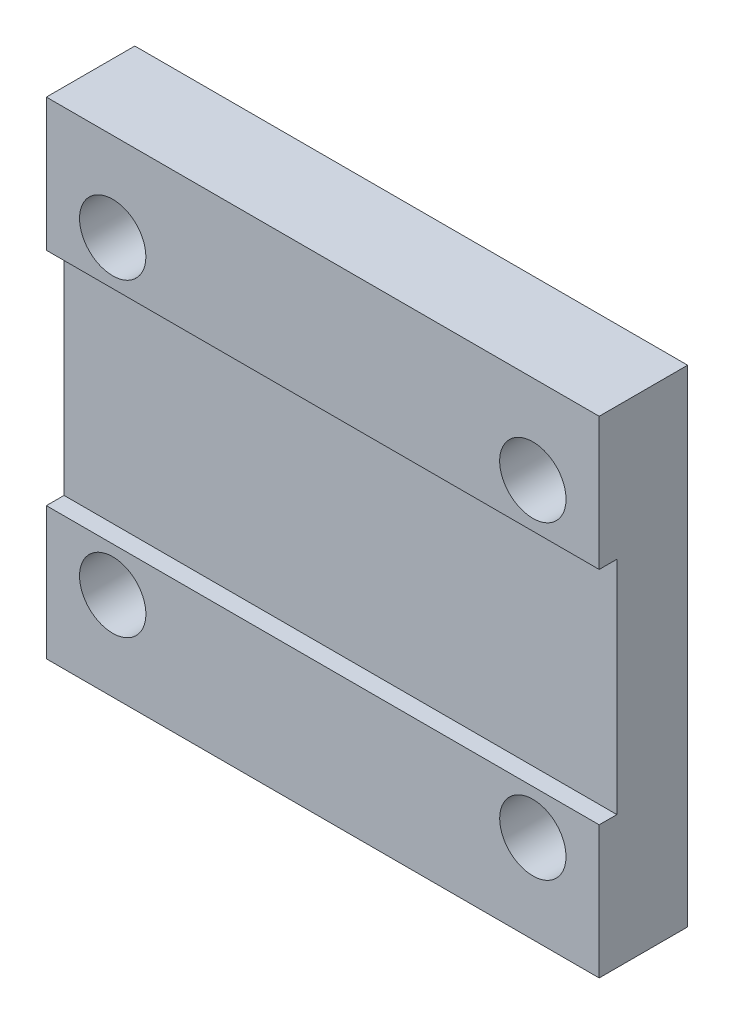
ISO-10303-21;
HEADER;
FILE_DESCRIPTION(('STEP AP214'),'2;1');
FILE_NAME('part.step','',(''),(''),'','','');
FILE_SCHEMA(('AUTOMOTIVE_DESIGN { 1 0 10303 214 1 1 1 1 }'));
ENDSEC;
DATA;
#1=APPLICATION_CONTEXT('core data for automotive mechanical design processes');
#2=APPLICATION_PROTOCOL_DEFINITION('international standard','automotive_design',2000,#1);
#3=PRODUCT_CONTEXT('',#1,'mechanical');
#4=PRODUCT('Part','Part','',(#3));
#5=PRODUCT_RELATED_PRODUCT_CATEGORY('part','',(#4));
#6=PRODUCT_DEFINITION_FORMATION('','',#4);
#7=PRODUCT_DEFINITION_CONTEXT('part definition',#1,'design');
#8=PRODUCT_DEFINITION('design','',#6,#7);
#9=PRODUCT_DEFINITION_SHAPE('','',#8);
#10=(LENGTH_UNIT() NAMED_UNIT(*) SI_UNIT(.MILLI.,.METRE.));
#11=(NAMED_UNIT(*) PLANE_ANGLE_UNIT() SI_UNIT($,.RADIAN.));
#12=(NAMED_UNIT(*) SI_UNIT($,.STERADIAN.) SOLID_ANGLE_UNIT());
#13=UNCERTAINTY_MEASURE_WITH_UNIT(LENGTH_MEASURE(1.E-05),#10,'distance_accuracy_value','');
#14=(GEOMETRIC_REPRESENTATION_CONTEXT(3) GLOBAL_UNCERTAINTY_ASSIGNED_CONTEXT((#13)) GLOBAL_UNIT_ASSIGNED_CONTEXT((#10,
#11,#12)) REPRESENTATION_CONTEXT('',''));
#15=CARTESIAN_POINT('',(0.,0.,0.));
#16=DIRECTION('',(0.,0.,1.));
#17=DIRECTION('',(1.,0.,0.));
#18=AXIS2_PLACEMENT_3D('',#15,#16,#17);
#19=CARTESIAN_POINT('',(0.,0.,4.));
#20=DIRECTION('',(0.,0.,-1.));
#21=DIRECTION('',(-1.,0.,0.));
#22=AXIS2_PLACEMENT_3D('',#19,#20,#21);
#23=PLANE('',#22);
#24=CARTESIAN_POINT('',(-9.5,-7.,4.));
#25=DIRECTION('',(0.,0.,1.));
#26=DIRECTION('',(-1.,0.,0.));
#27=AXIS2_PLACEMENT_3D('',#24,#25,#26);
#28=CIRCLE('',#27,1.5);
#29=CARTESIAN_POINT('',(-11.,-7.,4.));
#30=VERTEX_POINT('',#29);
#31=EDGE_CURVE('E148',#30,#30,#28,.T.);
#32=ORIENTED_EDGE('',*,*,#31,.F.);
#33=EDGE_LOOP('',(#32));
#34=FACE_BOUND('',#33,.T.);
#35=CARTESIAN_POINT('',(9.5,-6.99999999999999,4.));
#36=DIRECTION('',(0.,0.,1.));
#37=DIRECTION('',(-1.,0.,0.));
#38=AXIS2_PLACEMENT_3D('',#35,#36,#37);
#39=CIRCLE('',#38,1.5);
#40=CARTESIAN_POINT('',(8.,-6.99999999999999,4.));
#41=VERTEX_POINT('',#40);
#42=EDGE_CURVE('E158',#41,#41,#39,.T.);
#43=ORIENTED_EDGE('',*,*,#42,.F.);
#44=EDGE_LOOP('',(#43));
#45=FACE_BOUND('',#44,.T.);
#46=DIRECTION('',(0.,1.,0.));
#47=VECTOR('',#46,1.);
#48=CARTESIAN_POINT('',(12.5,-11.,4.));
#49=LINE('',#48,#47);
#50=CARTESIAN_POINT('',(12.5,-11.,4.));
#51=VERTEX_POINT('',#50);
#52=CARTESIAN_POINT('',(12.5,-5.,4.));
#53=VERTEX_POINT('',#52);
#54=EDGE_CURVE('E182',#51,#53,#49,.T.);
#55=ORIENTED_EDGE('',*,*,#54,.T.);
#56=DIRECTION('',(1.,0.,0.));
#57=VECTOR('',#56,1.);
#58=CARTESIAN_POINT('',(-12.5,-5.,4.));
#59=LINE('',#58,#57);
#60=CARTESIAN_POINT('',(-12.5,-5.,4.));
#61=VERTEX_POINT('',#60);
#62=EDGE_CURVE('E136',#61,#53,#59,.T.);
#63=ORIENTED_EDGE('',*,*,#62,.F.);
#64=DIRECTION('',(0.,-1.,0.));
#65=VECTOR('',#64,1.);
#66=CARTESIAN_POINT('',(-12.5,-11.,4.));
#67=LINE('',#66,#65);
#68=CARTESIAN_POINT('',(-12.5,-11.,4.));
#69=VERTEX_POINT('',#68);
#70=EDGE_CURVE('E188',#61,#69,#67,.T.);
#71=ORIENTED_EDGE('',*,*,#70,.T.);
#72=DIRECTION('',(1.,0.,0.));
#73=VECTOR('',#72,1.);
#74=CARTESIAN_POINT('',(-12.5,-11.,4.));
#75=LINE('',#74,#73);
#76=EDGE_CURVE('E68',#69,#51,#75,.T.);
#77=ORIENTED_EDGE('',*,*,#76,.T.);
#78=EDGE_LOOP('',(#55,#63,#71,#77));
#79=FACE_BOUND('',#78,.T.);
#80=ADVANCED_FACE('F43',(#34,#45,#79),#23,.F.);
#81=CARTESIAN_POINT('',(-12.5,11.,4.));
#82=VERTEX_POINT('',#81);
#83=CARTESIAN_POINT('',(-12.5,5.,4.));
#84=VERTEX_POINT('',#83);
#85=EDGE_CURVE('E189',#82,#84,#67,.T.);
#86=ORIENTED_EDGE('',*,*,#85,.T.);
#87=DIRECTION('',(-1.,0.,0.));
#88=VECTOR('',#87,1.);
#89=CARTESIAN_POINT('',(-12.5,5.,4.));
#90=LINE('',#89,#88);
#91=CARTESIAN_POINT('',(12.5,5.,4.));
#92=VERTEX_POINT('',#91);
#93=EDGE_CURVE('E238',#92,#84,#90,.T.);
#94=ORIENTED_EDGE('',*,*,#93,.F.);
#95=CARTESIAN_POINT('',(12.5,11.,4.));
#96=VERTEX_POINT('',#95);
#97=EDGE_CURVE('E97',#92,#96,#49,.T.);
#98=ORIENTED_EDGE('',*,*,#97,.T.);
#99=DIRECTION('',(-1.,0.,0.));
#100=VECTOR('',#99,1.);
#101=CARTESIAN_POINT('',(-12.5,11.,4.));
#102=LINE('',#101,#100);
#103=EDGE_CURVE('E185',#96,#82,#102,.T.);
#104=ORIENTED_EDGE('',*,*,#103,.T.);
#105=EDGE_LOOP('',(#86,#94,#98,#104));
#106=FACE_BOUND('',#105,.T.);
#107=CARTESIAN_POINT('',(-9.5,7.,4.));
#108=DIRECTION('',(0.,0.,1.));
#109=DIRECTION('',(1.,0.,0.));
#110=AXIS2_PLACEMENT_3D('',#107,#108,#109);
#111=CIRCLE('',#110,1.5);
#112=CARTESIAN_POINT('',(-8.,7.,4.));
#113=VERTEX_POINT('',#112);
#114=EDGE_CURVE('E174',#113,#113,#111,.T.);
#115=ORIENTED_EDGE('',*,*,#114,.F.);
#116=EDGE_LOOP('',(#115));
#117=FACE_BOUND('',#116,.T.);
#118=CARTESIAN_POINT('',(9.5,7.,4.));
#119=DIRECTION('',(0.,0.,1.));
#120=DIRECTION('',(1.,0.,0.));
#121=AXIS2_PLACEMENT_3D('',#118,#119,#120);
#122=CIRCLE('',#121,1.5);
#123=CARTESIAN_POINT('',(11.,7.,4.));
#124=VERTEX_POINT('',#123);
#125=EDGE_CURVE('E166',#124,#124,#122,.T.);
#126=ORIENTED_EDGE('',*,*,#125,.F.);
#127=EDGE_LOOP('',(#126));
#128=FACE_BOUND('',#127,.T.);
#129=ADVANCED_FACE('F244',(#106,#117,#128),#23,.F.);
#130=CARTESIAN_POINT('',(0.,0.,0.));
#131=DIRECTION('',(0.,0.,-1.));
#132=DIRECTION('',(-1.,0.,0.));
#133=AXIS2_PLACEMENT_3D('',#130,#131,#132);
#134=PLANE('',#133);
#135=CARTESIAN_POINT('',(9.5,-6.99999999999999,0.));
#136=DIRECTION('',(0.,0.,1.));
#137=DIRECTION('',(-1.,0.,0.));
#138=AXIS2_PLACEMENT_3D('',#135,#136,#137);
#139=CIRCLE('',#138,1.5);
#140=CARTESIAN_POINT('',(8.,-6.99999999999999,0.));
#141=VERTEX_POINT('',#140);
#142=EDGE_CURVE('E152',#141,#141,#139,.T.);
#143=ORIENTED_EDGE('',*,*,#142,.T.);
#144=EDGE_LOOP('',(#143));
#145=FACE_BOUND('',#144,.T.);
#146=CARTESIAN_POINT('',(-9.5,7.,0.));
#147=DIRECTION('',(0.,0.,1.));
#148=DIRECTION('',(1.,0.,0.));
#149=AXIS2_PLACEMENT_3D('',#146,#147,#148);
#150=CIRCLE('',#149,1.5);
#151=CARTESIAN_POINT('',(-8.,7.,0.));
#152=VERTEX_POINT('',#151);
#153=EDGE_CURVE('E170',#152,#152,#150,.T.);
#154=ORIENTED_EDGE('',*,*,#153,.T.);
#155=EDGE_LOOP('',(#154));
#156=FACE_BOUND('',#155,.T.);
#157=DIRECTION('',(0.,1.,0.));
#158=VECTOR('',#157,1.);
#159=CARTESIAN_POINT('',(12.5,-11.,0.));
#160=LINE('',#159,#158);
#161=CARTESIAN_POINT('',(12.5,-11.,0.));
#162=VERTEX_POINT('',#161);
#163=CARTESIAN_POINT('',(12.5,11.,0.));
#164=VERTEX_POINT('',#163);
#165=EDGE_CURVE('E178',#162,#164,#160,.T.);
#166=ORIENTED_EDGE('',*,*,#165,.F.);
#167=DIRECTION('',(1.,0.,0.));
#168=VECTOR('',#167,1.);
#169=CARTESIAN_POINT('',(-12.5,-11.,0.));
#170=LINE('',#169,#168);
#171=CARTESIAN_POINT('',(-12.5,-11.,0.));
#172=VERTEX_POINT('',#171);
#173=EDGE_CURVE('E89',#172,#162,#170,.T.);
#174=ORIENTED_EDGE('',*,*,#173,.F.);
#175=DIRECTION('',(0.,-1.,0.));
#176=VECTOR('',#175,1.);
#177=CARTESIAN_POINT('',(-12.5,-11.,0.));
#178=LINE('',#177,#176);
#179=CARTESIAN_POINT('',(-12.5,11.,0.));
#180=VERTEX_POINT('',#179);
#181=EDGE_CURVE('E202',#180,#172,#178,.T.);
#182=ORIENTED_EDGE('',*,*,#181,.F.);
#183=DIRECTION('',(-1.,0.,0.));
#184=VECTOR('',#183,1.);
#185=CARTESIAN_POINT('',(-12.5,11.,0.));
#186=LINE('',#185,#184);
#187=EDGE_CURVE('E199',#164,#180,#186,.T.);
#188=ORIENTED_EDGE('',*,*,#187,.F.);
#189=EDGE_LOOP('',(#166,#174,#182,#188));
#190=FACE_BOUND('',#189,.T.);
#191=CARTESIAN_POINT('',(9.5,7.,0.));
#192=DIRECTION('',(0.,0.,1.));
#193=DIRECTION('',(1.,0.,0.));
#194=AXIS2_PLACEMENT_3D('',#191,#192,#193);
#195=CIRCLE('',#194,1.5);
#196=CARTESIAN_POINT('',(11.,7.,0.));
#197=VERTEX_POINT('',#196);
#198=EDGE_CURVE('E162',#197,#197,#195,.T.);
#199=ORIENTED_EDGE('',*,*,#198,.T.);
#200=EDGE_LOOP('',(#199));
#201=FACE_BOUND('',#200,.T.);
#202=CARTESIAN_POINT('',(-9.5,-7.,0.));
#203=DIRECTION('',(0.,0.,1.));
#204=DIRECTION('',(-1.,0.,0.));
#205=AXIS2_PLACEMENT_3D('',#202,#203,#204);
#206=CIRCLE('',#205,1.5);
#207=CARTESIAN_POINT('',(-11.,-7.,0.));
#208=VERTEX_POINT('',#207);
#209=EDGE_CURVE('E153',#208,#208,#206,.T.);
#210=ORIENTED_EDGE('',*,*,#209,.T.);
#211=EDGE_LOOP('',(#210));
#212=FACE_BOUND('',#211,.T.);
#213=ADVANCED_FACE('F223',(#145,#156,#190,#201,#212),#134,.T.);
#214=CARTESIAN_POINT('',(12.5,-11.,4.));
#215=DIRECTION('',(-1.,0.,0.));
#216=DIRECTION('',(0.,0.,1.));
#217=AXIS2_PLACEMENT_3D('',#214,#215,#216);
#218=PLANE('',#217);
#219=DIRECTION('',(0.,1.,0.));
#220=VECTOR('',#219,1.);
#221=CARTESIAN_POINT('',(12.5,-5.,3.2));
#222=LINE('',#221,#220);
#223=CARTESIAN_POINT('',(12.5,-5.,3.2));
#224=VERTEX_POINT('',#223);
#225=CARTESIAN_POINT('',(12.5,5.,3.2));
#226=VERTEX_POINT('',#225);
#227=EDGE_CURVE('E126',#224,#226,#222,.T.);
#228=ORIENTED_EDGE('',*,*,#227,.F.);
#229=DIRECTION('',(0.,0.,1.));
#230=VECTOR('',#229,1.);
#231=CARTESIAN_POINT('',(12.5,-5.,3.2));
#232=LINE('',#231,#230);
#233=EDGE_CURVE('E157',#224,#53,#232,.T.);
#234=ORIENTED_EDGE('',*,*,#233,.T.);
#235=ORIENTED_EDGE('',*,*,#54,.F.);
#236=DIRECTION('',(0.,0.,-1.));
#237=VECTOR('',#236,1.);
#238=CARTESIAN_POINT('',(12.5,-11.,4.));
#239=LINE('',#238,#237);
#240=EDGE_CURVE('E195',#51,#162,#239,.T.);
#241=ORIENTED_EDGE('',*,*,#240,.T.);
#242=ORIENTED_EDGE('',*,*,#165,.T.);
#243=DIRECTION('',(0.,0.,-1.));
#244=VECTOR('',#243,1.);
#245=CARTESIAN_POINT('',(12.5,11.,4.));
#246=LINE('',#245,#244);
#247=EDGE_CURVE('E11',#96,#164,#246,.T.);
#248=ORIENTED_EDGE('',*,*,#247,.F.);
#249=ORIENTED_EDGE('',*,*,#97,.F.);
#250=DIRECTION('',(0.,0.,1.));
#251=VECTOR('',#250,1.);
#252=CARTESIAN_POINT('',(12.5,5.,3.2));
#253=LINE('',#252,#251);
#254=EDGE_CURVE('E120',#226,#92,#253,.T.);
#255=ORIENTED_EDGE('',*,*,#254,.F.);
#256=EDGE_LOOP('',(#228,#234,#235,#241,#242,#248,#249,#255));
#257=FACE_BOUND('',#256,.T.);
#258=ADVANCED_FACE('F45',(#257),#218,.F.);
#259=CARTESIAN_POINT('',(-12.5,11.,4.));
#260=DIRECTION('',(0.,-1.,0.));
#261=DIRECTION('',(0.,0.,-1.));
#262=AXIS2_PLACEMENT_3D('',#259,#260,#261);
#263=PLANE('',#262);
#264=ORIENTED_EDGE('',*,*,#187,.T.);
#265=DIRECTION('',(0.,0.,-1.));
#266=VECTOR('',#265,1.);
#267=CARTESIAN_POINT('',(-12.5,11.,4.));
#268=LINE('',#267,#266);
#269=EDGE_CURVE('E52',#82,#180,#268,.T.);
#270=ORIENTED_EDGE('',*,*,#269,.F.);
#271=ORIENTED_EDGE('',*,*,#103,.F.);
#272=ORIENTED_EDGE('',*,*,#247,.T.);
#273=EDGE_LOOP('',(#264,#270,#271,#272));
#274=FACE_BOUND('',#273,.T.);
#275=ADVANCED_FACE('F262',(#274),#263,.F.);
#276=CARTESIAN_POINT('',(-12.5,-11.,4.));
#277=DIRECTION('',(1.,0.,0.));
#278=DIRECTION('',(0.,0.,-1.));
#279=AXIS2_PLACEMENT_3D('',#276,#277,#278);
#280=PLANE('',#279);
#281=ORIENTED_EDGE('',*,*,#70,.F.);
#282=DIRECTION('',(0.,0.,1.));
#283=VECTOR('',#282,1.);
#284=CARTESIAN_POINT('',(-12.5,-5.,3.2));
#285=LINE('',#284,#283);
#286=CARTESIAN_POINT('',(-12.5,-5.,3.2));
#287=VERTEX_POINT('',#286);
#288=EDGE_CURVE('E143',#287,#61,#285,.T.);
#289=ORIENTED_EDGE('',*,*,#288,.F.);
#290=DIRECTION('',(0.,-1.,0.));
#291=VECTOR('',#290,1.);
#292=CARTESIAN_POINT('',(-12.5,-5.,3.2));
#293=LINE('',#292,#291);
#294=CARTESIAN_POINT('',(-12.5,5.,3.2));
#295=VERTEX_POINT('',#294);
#296=EDGE_CURVE('E125',#295,#287,#293,.T.);
#297=ORIENTED_EDGE('',*,*,#296,.F.);
#298=DIRECTION('',(0.,0.,1.));
#299=VECTOR('',#298,1.);
#300=CARTESIAN_POINT('',(-12.5,5.,3.2));
#301=LINE('',#300,#299);
#302=EDGE_CURVE('E122',#295,#84,#301,.T.);
#303=ORIENTED_EDGE('',*,*,#302,.T.);
#304=ORIENTED_EDGE('',*,*,#85,.F.);
#305=ORIENTED_EDGE('',*,*,#269,.T.);
#306=ORIENTED_EDGE('',*,*,#181,.T.);
#307=DIRECTION('',(0.,0.,-1.));
#308=VECTOR('',#307,1.);
#309=CARTESIAN_POINT('',(-12.5,-11.,4.));
#310=LINE('',#309,#308);
#311=EDGE_CURVE('E209',#69,#172,#310,.T.);
#312=ORIENTED_EDGE('',*,*,#311,.F.);
#313=EDGE_LOOP('',(#281,#289,#297,#303,#304,#305,#306,#312));
#314=FACE_BOUND('',#313,.T.);
#315=ADVANCED_FACE('F218',(#314),#280,.F.);
#316=CARTESIAN_POINT('',(-12.5,-11.,4.));
#317=DIRECTION('',(0.,1.,0.));
#318=DIRECTION('',(0.,0.,1.));
#319=AXIS2_PLACEMENT_3D('',#316,#317,#318);
#320=PLANE('',#319);
#321=ORIENTED_EDGE('',*,*,#173,.T.);
#322=ORIENTED_EDGE('',*,*,#240,.F.);
#323=ORIENTED_EDGE('',*,*,#76,.F.);
#324=ORIENTED_EDGE('',*,*,#311,.T.);
#325=EDGE_LOOP('',(#321,#322,#323,#324));
#326=FACE_BOUND('',#325,.T.);
#327=ADVANCED_FACE('F226',(#326),#320,.F.);
#328=CARTESIAN_POINT('',(-9.5,7.,4.));
#329=DIRECTION('',(0.,0.,-1.));
#330=DIRECTION('',(-1.,0.,0.));
#331=AXIS2_PLACEMENT_3D('',#328,#329,#330);
#332=CYLINDRICAL_SURFACE('',#331,1.5);
#333=ORIENTED_EDGE('',*,*,#114,.T.);
#334=EDGE_LOOP('',(#333));
#335=FACE_BOUND('',#334,.T.);
#336=ORIENTED_EDGE('',*,*,#153,.F.);
#337=EDGE_LOOP('',(#336));
#338=FACE_BOUND('',#337,.T.);
#339=ADVANCED_FACE('F254',(#335,#338),#332,.F.);
#340=CARTESIAN_POINT('',(9.5,7.,4.));
#341=DIRECTION('',(0.,0.,-1.));
#342=DIRECTION('',(-1.,0.,0.));
#343=AXIS2_PLACEMENT_3D('',#340,#341,#342);
#344=CYLINDRICAL_SURFACE('',#343,1.5);
#345=ORIENTED_EDGE('',*,*,#125,.T.);
#346=EDGE_LOOP('',(#345));
#347=FACE_BOUND('',#346,.T.);
#348=ORIENTED_EDGE('',*,*,#198,.F.);
#349=EDGE_LOOP('',(#348));
#350=FACE_BOUND('',#349,.T.);
#351=ADVANCED_FACE('F272',(#347,#350),#344,.F.);
#352=CARTESIAN_POINT('',(9.5,-6.99999999999999,4.));
#353=DIRECTION('',(0.,0.,-1.));
#354=DIRECTION('',(-1.,0.,0.));
#355=AXIS2_PLACEMENT_3D('',#352,#353,#354);
#356=CYLINDRICAL_SURFACE('',#355,1.5);
#357=ORIENTED_EDGE('',*,*,#42,.T.);
#358=EDGE_LOOP('',(#357));
#359=FACE_BOUND('',#358,.T.);
#360=ORIENTED_EDGE('',*,*,#142,.F.);
#361=EDGE_LOOP('',(#360));
#362=FACE_BOUND('',#361,.T.);
#363=ADVANCED_FACE('F275',(#359,#362),#356,.F.);
#364=CARTESIAN_POINT('',(-9.5,-7.,4.));
#365=DIRECTION('',(0.,0.,-1.));
#366=DIRECTION('',(-1.,0.,0.));
#367=AXIS2_PLACEMENT_3D('',#364,#365,#366);
#368=CYLINDRICAL_SURFACE('',#367,1.5);
#369=ORIENTED_EDGE('',*,*,#31,.T.);
#370=EDGE_LOOP('',(#369));
#371=FACE_BOUND('',#370,.T.);
#372=ORIENTED_EDGE('',*,*,#209,.F.);
#373=EDGE_LOOP('',(#372));
#374=FACE_BOUND('',#373,.T.);
#375=ADVANCED_FACE('F280',(#371,#374),#368,.F.);
#376=CARTESIAN_POINT('',(-12.5,-5.,3.2));
#377=DIRECTION('',(0.,-1.,0.));
#378=DIRECTION('',(1.,0.,0.));
#379=AXIS2_PLACEMENT_3D('',#376,#377,#378);
#380=PLANE('',#379);
#381=ORIENTED_EDGE('',*,*,#62,.T.);
#382=ORIENTED_EDGE('',*,*,#233,.F.);
#383=DIRECTION('',(1.,0.,0.));
#384=VECTOR('',#383,1.);
#385=CARTESIAN_POINT('',(-12.5,-5.,3.2));
#386=LINE('',#385,#384);
#387=EDGE_CURVE('E132',#287,#224,#386,.T.);
#388=ORIENTED_EDGE('',*,*,#387,.F.);
#389=ORIENTED_EDGE('',*,*,#288,.T.);
#390=EDGE_LOOP('',(#381,#382,#388,#389));
#391=FACE_BOUND('',#390,.T.);
#392=ADVANCED_FACE('F242',(#391),#380,.F.);
#393=CARTESIAN_POINT('',(-12.5,5.,3.2));
#394=DIRECTION('',(0.,1.,0.));
#395=DIRECTION('',(-1.,0.,0.));
#396=AXIS2_PLACEMENT_3D('',#393,#394,#395);
#397=PLANE('',#396);
#398=ORIENTED_EDGE('',*,*,#93,.T.);
#399=ORIENTED_EDGE('',*,*,#302,.F.);
#400=DIRECTION('',(-1.,0.,0.));
#401=VECTOR('',#400,1.);
#402=CARTESIAN_POINT('',(-12.5,5.,3.2));
#403=LINE('',#402,#401);
#404=EDGE_CURVE('E59',#226,#295,#403,.T.);
#405=ORIENTED_EDGE('',*,*,#404,.F.);
#406=ORIENTED_EDGE('',*,*,#254,.T.);
#407=EDGE_LOOP('',(#398,#399,#405,#406));
#408=FACE_BOUND('',#407,.T.);
#409=ADVANCED_FACE('F118',(#408),#397,.F.);
#410=CARTESIAN_POINT('',(0.,0.,3.2));
#411=DIRECTION('',(0.,0.,-1.));
#412=DIRECTION('',(-1.,0.,0.));
#413=AXIS2_PLACEMENT_3D('',#410,#411,#412);
#414=PLANE('',#413);
#415=ORIENTED_EDGE('',*,*,#227,.T.);
#416=ORIENTED_EDGE('',*,*,#404,.T.);
#417=ORIENTED_EDGE('',*,*,#296,.T.);
#418=ORIENTED_EDGE('',*,*,#387,.T.);
#419=EDGE_LOOP('',(#415,#416,#417,#418));
#420=FACE_BOUND('',#419,.T.);
#421=ADVANCED_FACE('F130',(#420),#414,.F.);
#422=CLOSED_SHELL('',(#80,#129,#213,#258,#275,#315,#327,#339,#351,#363,#375,#392,#409,#421));
#423=MANIFOLD_SOLID_BREP('B2',#422);
#424=ADVANCED_BREP_SHAPE_REPRESENTATION('',(#18,#423),#14);
#425=SHAPE_DEFINITION_REPRESENTATION(#9,#424);
ENDSEC;
END-ISO-10303-21;
